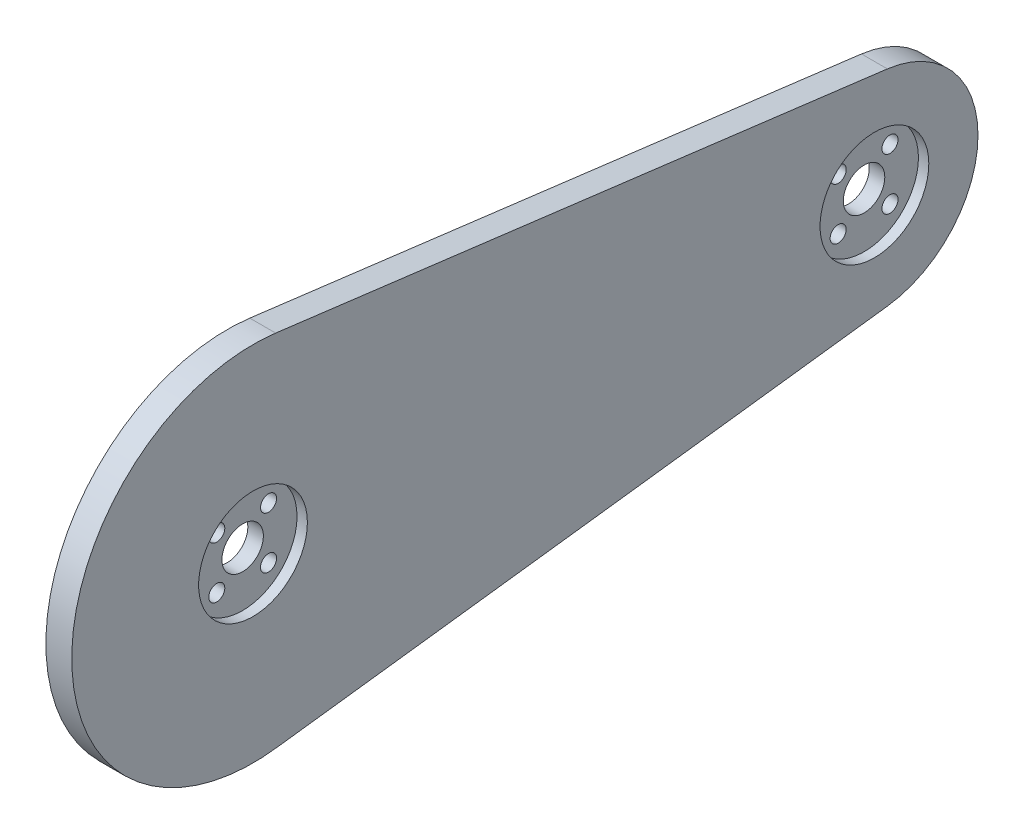
ISO-10303-21;
HEADER;
FILE_DESCRIPTION(('STEP AP214'),'2;1');
FILE_NAME('part.step','',(''),(''),'','','');
FILE_SCHEMA(('AUTOMOTIVE_DESIGN { 1 0 10303 214 1 1 1 1 }'));
ENDSEC;
DATA;
#1=APPLICATION_CONTEXT('core data for automotive mechanical design processes');
#2=APPLICATION_PROTOCOL_DEFINITION('international standard','automotive_design',2000,#1);
#3=PRODUCT_CONTEXT('',#1,'mechanical');
#4=PRODUCT('Part','Part','',(#3));
#5=PRODUCT_RELATED_PRODUCT_CATEGORY('part','',(#4));
#6=PRODUCT_DEFINITION_FORMATION('','',#4);
#7=PRODUCT_DEFINITION_CONTEXT('part definition',#1,'design');
#8=PRODUCT_DEFINITION('design','',#6,#7);
#9=PRODUCT_DEFINITION_SHAPE('','',#8);
#10=(LENGTH_UNIT() NAMED_UNIT(*) SI_UNIT(.MILLI.,.METRE.));
#11=(NAMED_UNIT(*) PLANE_ANGLE_UNIT() SI_UNIT($,.RADIAN.));
#12=(NAMED_UNIT(*) SI_UNIT($,.STERADIAN.) SOLID_ANGLE_UNIT());
#13=UNCERTAINTY_MEASURE_WITH_UNIT(LENGTH_MEASURE(1.E-05),#10,'distance_accuracy_value','');
#14=(GEOMETRIC_REPRESENTATION_CONTEXT(3) GLOBAL_UNCERTAINTY_ASSIGNED_CONTEXT((#13)) GLOBAL_UNIT_ASSIGNED_CONTEXT((#10,
#11,#12)) REPRESENTATION_CONTEXT('',''));
#15=CARTESIAN_POINT('',(0.,0.,0.));
#16=DIRECTION('',(0.,0.,1.));
#17=DIRECTION('',(1.,0.,0.));
#18=AXIS2_PLACEMENT_3D('',#15,#16,#17);
#19=CARTESIAN_POINT('',(5.,-4.99999999999989,-125.));
#20=DIRECTION('',(-1.,0.,0.));
#21=DIRECTION('',(0.,0.,1.));
#22=AXIS2_PLACEMENT_3D('',#19,#20,#21);
#23=CYLINDRICAL_SURFACE('',#22,1.54999999999998);
#24=CARTESIAN_POINT('',(0.,-4.99999999999989,-125.));
#25=DIRECTION('',(1.,0.,0.));
#26=DIRECTION('',(0.,0.,-1.));
#27=AXIS2_PLACEMENT_3D('',#24,#25,#26);
#28=CIRCLE('',#27,1.54999999999998);
#29=CARTESIAN_POINT('',(0.,-4.99999999999989,-126.55));
#30=VERTEX_POINT('',#29);
#31=EDGE_CURVE('E162',#30,#30,#28,.T.);
#32=ORIENTED_EDGE('',*,*,#31,.F.);
#33=EDGE_LOOP('',(#32));
#34=FACE_BOUND('',#33,.T.);
#35=CARTESIAN_POINT('',(3.,-4.99999999999989,-125.));
#36=DIRECTION('',(1.,0.,0.));
#37=DIRECTION('',(0.,0.,-1.));
#38=AXIS2_PLACEMENT_3D('',#35,#36,#37);
#39=CIRCLE('',#38,1.54999999999998);
#40=CARTESIAN_POINT('',(3.,-4.99999999999989,-126.55));
#41=VERTEX_POINT('',#40);
#42=EDGE_CURVE('E209',#41,#41,#39,.T.);
#43=ORIENTED_EDGE('',*,*,#42,.T.);
#44=EDGE_LOOP('',(#43));
#45=FACE_BOUND('',#44,.T.);
#46=ADVANCED_FACE('F47',(#34,#45),#23,.F.);
#47=CARTESIAN_POINT('',(5.,0.,0.));
#48=DIRECTION('',(-1.,0.,0.));
#49=DIRECTION('',(0.,0.,1.));
#50=AXIS2_PLACEMENT_3D('',#47,#48,#49);
#51=CYLINDRICAL_SURFACE('',#50,4.);
#52=CARTESIAN_POINT('',(0.,0.,0.));
#53=DIRECTION('',(1.,0.,0.));
#54=DIRECTION('',(0.,0.,-1.));
#55=AXIS2_PLACEMENT_3D('',#52,#53,#54);
#56=CIRCLE('',#55,4.);
#57=CARTESIAN_POINT('',(0.,0.,-4.));
#58=VERTEX_POINT('',#57);
#59=EDGE_CURVE('E158',#58,#58,#56,.T.);
#60=ORIENTED_EDGE('',*,*,#59,.F.);
#61=EDGE_LOOP('',(#60));
#62=FACE_BOUND('',#61,.T.);
#63=CARTESIAN_POINT('',(3.,0.,0.));
#64=DIRECTION('',(1.,0.,0.));
#65=DIRECTION('',(0.,0.,-1.));
#66=AXIS2_PLACEMENT_3D('',#63,#64,#65);
#67=CIRCLE('',#66,4.);
#68=CARTESIAN_POINT('',(3.,0.,-4.));
#69=VERTEX_POINT('',#68);
#70=EDGE_CURVE('E123',#69,#69,#67,.T.);
#71=ORIENTED_EDGE('',*,*,#70,.T.);
#72=EDGE_LOOP('',(#71));
#73=FACE_BOUND('',#72,.T.);
#74=ADVANCED_FACE('F248',(#62,#73),#51,.F.);
#75=CARTESIAN_POINT('',(5.,-5.00000000000004,-4.99999999999996));
#76=DIRECTION('',(-1.,0.,0.));
#77=DIRECTION('',(0.,0.,1.));
#78=AXIS2_PLACEMENT_3D('',#75,#76,#77);
#79=CYLINDRICAL_SURFACE('',#78,1.55);
#80=CARTESIAN_POINT('',(0.,-5.00000000000004,-4.99999999999996));
#81=DIRECTION('',(1.,0.,0.));
#82=DIRECTION('',(0.,0.,-1.));
#83=AXIS2_PLACEMENT_3D('',#80,#81,#82);
#84=CIRCLE('',#83,1.55);
#85=CARTESIAN_POINT('',(0.,-5.00000000000004,-6.54999999999996));
#86=VERTEX_POINT('',#85);
#87=EDGE_CURVE('E154',#86,#86,#84,.T.);
#88=ORIENTED_EDGE('',*,*,#87,.F.);
#89=EDGE_LOOP('',(#88));
#90=FACE_BOUND('',#89,.T.);
#91=CARTESIAN_POINT('',(3.,-5.00000000000004,-4.99999999999996));
#92=DIRECTION('',(1.,0.,0.));
#93=DIRECTION('',(0.,0.,-1.));
#94=AXIS2_PLACEMENT_3D('',#91,#92,#93);
#95=CIRCLE('',#94,1.55);
#96=CARTESIAN_POINT('',(3.,-5.00000000000004,-6.54999999999996));
#97=VERTEX_POINT('',#96);
#98=EDGE_CURVE('E221',#97,#97,#95,.T.);
#99=ORIENTED_EDGE('',*,*,#98,.T.);
#100=EDGE_LOOP('',(#99));
#101=FACE_BOUND('',#100,.T.);
#102=ADVANCED_FACE('F255',(#90,#101),#79,.F.);
#103=CARTESIAN_POINT('',(5.,-4.99999999999995,5.00000000000005));
#104=DIRECTION('',(-1.,0.,0.));
#105=DIRECTION('',(0.,0.,1.));
#106=AXIS2_PLACEMENT_3D('',#103,#104,#105);
#107=CYLINDRICAL_SURFACE('',#106,1.55);
#108=CARTESIAN_POINT('',(0.,-4.99999999999995,5.00000000000005));
#109=DIRECTION('',(1.,0.,0.));
#110=DIRECTION('',(0.,0.,-1.));
#111=AXIS2_PLACEMENT_3D('',#108,#109,#110);
#112=CIRCLE('',#111,1.55);
#113=CARTESIAN_POINT('',(0.,-4.99999999999995,3.45000000000005));
#114=VERTEX_POINT('',#113);
#115=EDGE_CURVE('E150',#114,#114,#112,.T.);
#116=ORIENTED_EDGE('',*,*,#115,.F.);
#117=EDGE_LOOP('',(#116));
#118=FACE_BOUND('',#117,.T.);
#119=CARTESIAN_POINT('',(3.,-4.99999999999995,5.00000000000005));
#120=DIRECTION('',(1.,0.,0.));
#121=DIRECTION('',(0.,0.,-1.));
#122=AXIS2_PLACEMENT_3D('',#119,#120,#121);
#123=CIRCLE('',#122,1.55);
#124=CARTESIAN_POINT('',(3.,-4.99999999999995,3.45000000000005));
#125=VERTEX_POINT('',#124);
#126=EDGE_CURVE('E217',#125,#125,#123,.T.);
#127=ORIENTED_EDGE('',*,*,#126,.T.);
#128=EDGE_LOOP('',(#127));
#129=FACE_BOUND('',#128,.T.);
#130=ADVANCED_FACE('F266',(#118,#129),#107,.F.);
#131=CARTESIAN_POINT('',(5.,4.99999999999998,-5.00000000000002));
#132=DIRECTION('',(-1.,0.,0.));
#133=DIRECTION('',(0.,0.,1.));
#134=AXIS2_PLACEMENT_3D('',#131,#132,#133);
#135=CYLINDRICAL_SURFACE('',#134,1.55);
#136=CARTESIAN_POINT('',(0.,4.99999999999998,-5.00000000000002));
#137=DIRECTION('',(1.,0.,0.));
#138=DIRECTION('',(0.,0.,-1.));
#139=AXIS2_PLACEMENT_3D('',#136,#137,#138);
#140=CIRCLE('',#139,1.55);
#141=CARTESIAN_POINT('',(0.,4.99999999999998,-6.55000000000002));
#142=VERTEX_POINT('',#141);
#143=EDGE_CURVE('E146',#142,#142,#140,.T.);
#144=ORIENTED_EDGE('',*,*,#143,.F.);
#145=EDGE_LOOP('',(#144));
#146=FACE_BOUND('',#145,.T.);
#147=CARTESIAN_POINT('',(3.,4.99999999999998,-5.00000000000002));
#148=DIRECTION('',(1.,0.,0.));
#149=DIRECTION('',(0.,0.,-1.));
#150=AXIS2_PLACEMENT_3D('',#147,#148,#149);
#151=CIRCLE('',#150,1.55);
#152=CARTESIAN_POINT('',(3.,4.99999999999998,-6.55000000000002));
#153=VERTEX_POINT('',#152);
#154=EDGE_CURVE('E213',#153,#153,#151,.T.);
#155=ORIENTED_EDGE('',*,*,#154,.T.);
#156=EDGE_LOOP('',(#155));
#157=FACE_BOUND('',#156,.T.);
#158=ADVANCED_FACE('F270',(#146,#157),#135,.F.);
#159=CARTESIAN_POINT('',(5.,5.,5.));
#160=DIRECTION('',(-1.,0.,0.));
#161=DIRECTION('',(0.,0.,1.));
#162=AXIS2_PLACEMENT_3D('',#159,#160,#161);
#163=CYLINDRICAL_SURFACE('',#162,1.55);
#164=CARTESIAN_POINT('',(0.,5.,5.));
#165=DIRECTION('',(1.,0.,0.));
#166=DIRECTION('',(0.,0.,-1.));
#167=AXIS2_PLACEMENT_3D('',#164,#165,#166);
#168=CIRCLE('',#167,1.55);
#169=CARTESIAN_POINT('',(0.,5.,3.45));
#170=VERTEX_POINT('',#169);
#171=EDGE_CURVE('E142',#170,#170,#168,.T.);
#172=ORIENTED_EDGE('',*,*,#171,.F.);
#173=EDGE_LOOP('',(#172));
#174=FACE_BOUND('',#173,.T.);
#175=CARTESIAN_POINT('',(3.,5.,5.));
#176=DIRECTION('',(1.,0.,0.));
#177=DIRECTION('',(0.,0.,-1.));
#178=AXIS2_PLACEMENT_3D('',#175,#176,#177);
#179=CIRCLE('',#178,1.55);
#180=CARTESIAN_POINT('',(3.,5.,3.45));
#181=VERTEX_POINT('',#180);
#182=EDGE_CURVE('E51',#181,#181,#179,.T.);
#183=ORIENTED_EDGE('',*,*,#182,.T.);
#184=EDGE_LOOP('',(#183));
#185=FACE_BOUND('',#184,.T.);
#186=ADVANCED_FACE('F232',(#174,#185),#163,.F.);
#187=CARTESIAN_POINT('',(5.,-4.99999999999995,-115.));
#188=DIRECTION('',(-1.,0.,0.));
#189=DIRECTION('',(0.,0.,1.));
#190=AXIS2_PLACEMENT_3D('',#187,#188,#189);
#191=CYLINDRICAL_SURFACE('',#190,1.54999999999999);
#192=CARTESIAN_POINT('',(0.,-4.99999999999995,-115.));
#193=DIRECTION('',(1.,0.,0.));
#194=DIRECTION('',(0.,0.,-1.));
#195=AXIS2_PLACEMENT_3D('',#192,#193,#194);
#196=CIRCLE('',#195,1.54999999999999);
#197=CARTESIAN_POINT('',(0.,-4.99999999999995,-116.55));
#198=VERTEX_POINT('',#197);
#199=EDGE_CURVE('E127',#198,#198,#196,.T.);
#200=ORIENTED_EDGE('',*,*,#199,.F.);
#201=EDGE_LOOP('',(#200));
#202=FACE_BOUND('',#201,.T.);
#203=CARTESIAN_POINT('',(3.,-4.99999999999995,-115.));
#204=DIRECTION('',(1.,0.,0.));
#205=DIRECTION('',(0.,0.,-1.));
#206=AXIS2_PLACEMENT_3D('',#203,#204,#205);
#207=CIRCLE('',#206,1.54999999999999);
#208=CARTESIAN_POINT('',(3.,-4.99999999999995,-116.55));
#209=VERTEX_POINT('',#208);
#210=EDGE_CURVE('E205',#209,#209,#207,.T.);
#211=ORIENTED_EDGE('',*,*,#210,.T.);
#212=EDGE_LOOP('',(#211));
#213=FACE_BOUND('',#212,.T.);
#214=ADVANCED_FACE('F277',(#202,#213),#191,.F.);
#215=CARTESIAN_POINT('',(5.,5.00000000000016,-125.));
#216=DIRECTION('',(-1.,0.,0.));
#217=DIRECTION('',(0.,0.,1.));
#218=AXIS2_PLACEMENT_3D('',#215,#216,#217);
#219=CYLINDRICAL_SURFACE('',#218,1.54999999999999);
#220=CARTESIAN_POINT('',(0.,5.00000000000016,-125.));
#221=DIRECTION('',(1.,0.,0.));
#222=DIRECTION('',(0.,0.,-1.));
#223=AXIS2_PLACEMENT_3D('',#220,#221,#222);
#224=CIRCLE('',#223,1.54999999999999);
#225=CARTESIAN_POINT('',(0.,5.00000000000016,-126.55));
#226=VERTEX_POINT('',#225);
#227=EDGE_CURVE('E122',#226,#226,#224,.T.);
#228=ORIENTED_EDGE('',*,*,#227,.F.);
#229=EDGE_LOOP('',(#228));
#230=FACE_BOUND('',#229,.T.);
#231=CARTESIAN_POINT('',(3.,5.00000000000016,-125.));
#232=DIRECTION('',(1.,0.,0.));
#233=DIRECTION('',(0.,0.,-1.));
#234=AXIS2_PLACEMENT_3D('',#231,#232,#233);
#235=CIRCLE('',#234,1.54999999999999);
#236=CARTESIAN_POINT('',(3.,5.00000000000016,-126.55));
#237=VERTEX_POINT('',#236);
#238=EDGE_CURVE('E183',#237,#237,#235,.T.);
#239=ORIENTED_EDGE('',*,*,#238,.T.);
#240=EDGE_LOOP('',(#239));
#241=FACE_BOUND('',#240,.T.);
#242=ADVANCED_FACE('F291',(#230,#241),#219,.F.);
#243=CARTESIAN_POINT('',(5.,5.,-115.));
#244=DIRECTION('',(-1.,0.,0.));
#245=DIRECTION('',(0.,0.,1.));
#246=AXIS2_PLACEMENT_3D('',#243,#244,#245);
#247=CYLINDRICAL_SURFACE('',#246,1.54999999999999);
#248=CARTESIAN_POINT('',(0.,5.,-115.));
#249=DIRECTION('',(1.,0.,0.));
#250=DIRECTION('',(0.,0.,-1.));
#251=AXIS2_PLACEMENT_3D('',#248,#249,#250);
#252=CIRCLE('',#251,1.54999999999999);
#253=CARTESIAN_POINT('',(0.,5.,-116.55));
#254=VERTEX_POINT('',#253);
#255=EDGE_CURVE('E118',#254,#254,#252,.T.);
#256=ORIENTED_EDGE('',*,*,#255,.F.);
#257=EDGE_LOOP('',(#256));
#258=FACE_BOUND('',#257,.T.);
#259=CARTESIAN_POINT('',(3.,5.,-115.));
#260=DIRECTION('',(1.,0.,0.));
#261=DIRECTION('',(0.,0.,-1.));
#262=AXIS2_PLACEMENT_3D('',#259,#260,#261);
#263=CIRCLE('',#262,1.54999999999999);
#264=CARTESIAN_POINT('',(3.,5.,-116.55));
#265=VERTEX_POINT('',#264);
#266=EDGE_CURVE('E176',#265,#265,#263,.T.);
#267=ORIENTED_EDGE('',*,*,#266,.T.);
#268=EDGE_LOOP('',(#267));
#269=FACE_BOUND('',#268,.T.);
#270=ADVANCED_FACE('F49',(#258,#269),#247,.F.);
#271=CARTESIAN_POINT('',(5.,0.,-120.));
#272=DIRECTION('',(-1.,0.,0.));
#273=DIRECTION('',(0.,0.,1.));
#274=AXIS2_PLACEMENT_3D('',#271,#272,#273);
#275=CYLINDRICAL_SURFACE('',#274,4.00000000000001);
#276=CARTESIAN_POINT('',(0.,0.,-120.));
#277=DIRECTION('',(1.,0.,0.));
#278=DIRECTION('',(0.,0.,-1.));
#279=AXIS2_PLACEMENT_3D('',#276,#277,#278);
#280=CIRCLE('',#279,4.00000000000001);
#281=CARTESIAN_POINT('',(0.,0.,-124.));
#282=VERTEX_POINT('',#281);
#283=EDGE_CURVE('E166',#282,#282,#280,.T.);
#284=ORIENTED_EDGE('',*,*,#283,.F.);
#285=EDGE_LOOP('',(#284));
#286=FACE_BOUND('',#285,.T.);
#287=CARTESIAN_POINT('',(3.,0.,-120.));
#288=DIRECTION('',(1.,0.,0.));
#289=DIRECTION('',(0.,0.,-1.));
#290=AXIS2_PLACEMENT_3D('',#287,#288,#289);
#291=CIRCLE('',#290,4.00000000000001);
#292=CARTESIAN_POINT('',(3.,0.,-124.));
#293=VERTEX_POINT('',#292);
#294=EDGE_CURVE('E173',#293,#293,#291,.T.);
#295=ORIENTED_EDGE('',*,*,#294,.T.);
#296=EDGE_LOOP('',(#295));
#297=FACE_BOUND('',#296,.T.);
#298=ADVANCED_FACE('F261',(#286,#297),#275,.F.);
#299=CARTESIAN_POINT('',(5.,-34.7200280183255,-4.37262002707089));
#300=DIRECTION('',(0.,0.992162738142365,0.124952395102475));
#301=DIRECTION('',(0.,-0.124952395102475,0.992162738142365));
#302=AXIS2_PLACEMENT_3D('',#299,#300,#301);
#303=PLANE('',#302);
#304=DIRECTION('',(0.,0.124952395102475,-0.992162738142365));
#305=VECTOR('',#304,1.);
#306=CARTESIAN_POINT('',(0.,-34.7200280183255,-4.37262002707089));
#307=LINE('',#306,#305);
#308=CARTESIAN_POINT('',(0.,-34.6410161513773,-5.0000000000019));
#309=VERTEX_POINT('',#308);
#310=CARTESIAN_POINT('',(0.,-19.8432547628473,-122.499047902049));
#311=VERTEX_POINT('',#310);
#312=EDGE_CURVE('E131',#309,#311,#307,.T.);
#313=ORIENTED_EDGE('',*,*,#312,.T.);
#314=DIRECTION('',(-1.,0.,0.));
#315=VECTOR('',#314,1.);
#316=CARTESIAN_POINT('',(5.,-19.8432547628473,-122.499047902049));
#317=LINE('',#316,#315);
#318=CARTESIAN_POINT('',(5.,-19.8432547628473,-122.499047902049));
#319=VERTEX_POINT('',#318);
#320=EDGE_CURVE('E11',#319,#311,#317,.T.);
#321=ORIENTED_EDGE('',*,*,#320,.F.);
#322=DIRECTION('',(0.,0.124952395102475,-0.992162738142365));
#323=VECTOR('',#322,1.);
#324=CARTESIAN_POINT('',(5.,-34.7200280183255,-4.37262002707089));
#325=LINE('',#324,#323);
#326=CARTESIAN_POINT('',(5.,-34.6410161513773,-5.0000000000019));
#327=VERTEX_POINT('',#326);
#328=EDGE_CURVE('E98',#327,#319,#325,.T.);
#329=ORIENTED_EDGE('',*,*,#328,.F.);
#330=DIRECTION('',(-1.,0.,0.));
#331=VECTOR('',#330,1.);
#332=CARTESIAN_POINT('',(5.,-34.6410161513773,-5.0000000000019));
#333=LINE('',#332,#331);
#334=EDGE_CURVE('E114',#327,#309,#333,.T.);
#335=ORIENTED_EDGE('',*,*,#334,.T.);
#336=EDGE_LOOP('',(#313,#321,#329,#335));
#337=FACE_BOUND('',#336,.T.);
#338=ADVANCED_FACE('F286',(#337),#303,.F.);
#339=CARTESIAN_POINT('',(5.,0.,-120.));
#340=DIRECTION('',(-1.,0.,0.));
#341=DIRECTION('',(0.,0.,1.));
#342=AXIS2_PLACEMENT_3D('',#339,#340,#341);
#343=CYLINDRICAL_SURFACE('',#342,20.);
#344=CARTESIAN_POINT('',(0.,0.,-120.));
#345=DIRECTION('',(1.,0.,0.));
#346=DIRECTION('',(0.,0.,-1.));
#347=AXIS2_PLACEMENT_3D('',#344,#345,#346);
#348=CIRCLE('',#347,20.);
#349=CARTESIAN_POINT('',(0.,19.8431348329844,-122.5));
#350=VERTEX_POINT('',#349);
#351=EDGE_CURVE('E104',#311,#350,#348,.T.);
#352=ORIENTED_EDGE('',*,*,#351,.T.);
#353=DIRECTION('',(-1.,0.,0.));
#354=VECTOR('',#353,1.);
#355=CARTESIAN_POINT('',(5.,19.8431348329844,-122.5));
#356=LINE('',#355,#354);
#357=CARTESIAN_POINT('',(5.,19.8431348329844,-122.5));
#358=VERTEX_POINT('',#357);
#359=EDGE_CURVE('E58',#358,#350,#356,.T.);
#360=ORIENTED_EDGE('',*,*,#359,.F.);
#361=CARTESIAN_POINT('',(5.,0.,-120.));
#362=DIRECTION('',(1.,0.,0.));
#363=DIRECTION('',(0.,0.,-1.));
#364=AXIS2_PLACEMENT_3D('',#361,#362,#363);
#365=CIRCLE('',#364,20.);
#366=EDGE_CURVE('E93',#319,#358,#365,.T.);
#367=ORIENTED_EDGE('',*,*,#366,.F.);
#368=ORIENTED_EDGE('',*,*,#320,.T.);
#369=EDGE_LOOP('',(#352,#360,#367,#368));
#370=FACE_BOUND('',#369,.T.);
#371=ADVANCED_FACE('F103',(#370),#343,.T.);
#372=CARTESIAN_POINT('',(5.,34.7254859577227,-4.375));
#373=DIRECTION('',(0.,0.992156741649222,-0.125));
#374=DIRECTION('',(0.,0.125,0.992156741649222));
#375=AXIS2_PLACEMENT_3D('',#372,#373,#374);
#376=PLANE('',#375);
#377=DIRECTION('',(0.,-0.125,-0.992156741649222));
#378=VECTOR('',#377,1.);
#379=CARTESIAN_POINT('',(0.,34.7254859577227,-4.375));
#380=LINE('',#379,#378);
#381=CARTESIAN_POINT('',(0.,34.7254859577228,-4.375));
#382=VERTEX_POINT('',#381);
#383=EDGE_CURVE('E137',#382,#350,#380,.T.);
#384=ORIENTED_EDGE('',*,*,#383,.F.);
#385=DIRECTION('',(-1.,0.,0.));
#386=VECTOR('',#385,1.);
#387=CARTESIAN_POINT('',(5.,34.7254859577228,-4.375));
#388=LINE('',#387,#386);
#389=CARTESIAN_POINT('',(5.,34.7254859577228,-4.375));
#390=VERTEX_POINT('',#389);
#391=EDGE_CURVE('E83',#390,#382,#388,.T.);
#392=ORIENTED_EDGE('',*,*,#391,.F.);
#393=DIRECTION('',(0.,-0.125,-0.992156741649222));
#394=VECTOR('',#393,1.);
#395=CARTESIAN_POINT('',(5.,34.7254859577227,-4.375));
#396=LINE('',#395,#394);
#397=EDGE_CURVE('E96',#390,#358,#396,.T.);
#398=ORIENTED_EDGE('',*,*,#397,.T.);
#399=ORIENTED_EDGE('',*,*,#359,.T.);
#400=EDGE_LOOP('',(#384,#392,#398,#399));
#401=FACE_BOUND('',#400,.T.);
#402=ADVANCED_FACE('F110',(#401),#376,.T.);
#403=CARTESIAN_POINT('',(5.,0.,0.));
#404=DIRECTION('',(-1.,0.,0.));
#405=DIRECTION('',(0.,0.,1.));
#406=AXIS2_PLACEMENT_3D('',#403,#404,#405);
#407=CYLINDRICAL_SURFACE('',#406,35.);
#408=CARTESIAN_POINT('',(0.,0.,0.));
#409=DIRECTION('',(1.,0.,0.));
#410=DIRECTION('',(0.,0.,-1.));
#411=AXIS2_PLACEMENT_3D('',#408,#409,#410);
#412=CIRCLE('',#411,35.);
#413=EDGE_CURVE('E86',#382,#309,#412,.T.);
#414=ORIENTED_EDGE('',*,*,#413,.T.);
#415=ORIENTED_EDGE('',*,*,#334,.F.);
#416=CARTESIAN_POINT('',(5.,0.,0.));
#417=DIRECTION('',(1.,0.,0.));
#418=DIRECTION('',(0.,0.,-1.));
#419=AXIS2_PLACEMENT_3D('',#416,#417,#418);
#420=CIRCLE('',#419,35.);
#421=EDGE_CURVE('E67',#390,#327,#420,.T.);
#422=ORIENTED_EDGE('',*,*,#421,.F.);
#423=ORIENTED_EDGE('',*,*,#391,.T.);
#424=EDGE_LOOP('',(#414,#415,#422,#423));
#425=FACE_BOUND('',#424,.T.);
#426=ADVANCED_FACE('F279',(#425),#407,.T.);
#427=CARTESIAN_POINT('',(5.,0.,0.));
#428=DIRECTION('',(1.,0.,0.));
#429=DIRECTION('',(0.,0.,-1.));
#430=AXIS2_PLACEMENT_3D('',#427,#428,#429);
#431=PLANE('',#430);
#432=CARTESIAN_POINT('',(5.,0.,0.));
#433=DIRECTION('',(1.,0.,0.));
#434=DIRECTION('',(0.,0.,-1.));
#435=AXIS2_PLACEMENT_3D('',#432,#433,#434);
#436=CIRCLE('',#435,10.5);
#437=CARTESIAN_POINT('',(5.,0.,-10.5));
#438=VERTEX_POINT('',#437);
#439=EDGE_CURVE('E186',#438,#438,#436,.T.);
#440=ORIENTED_EDGE('',*,*,#439,.F.);
#441=EDGE_LOOP('',(#440));
#442=FACE_BOUND('',#441,.T.);
#443=CARTESIAN_POINT('',(5.,0.,-120.));
#444=DIRECTION('',(1.,0.,0.));
#445=DIRECTION('',(0.,0.,-1.));
#446=AXIS2_PLACEMENT_3D('',#443,#444,#445);
#447=CIRCLE('',#446,10.5);
#448=CARTESIAN_POINT('',(5.,0.,-130.5));
#449=VERTEX_POINT('',#448);
#450=EDGE_CURVE('E192',#449,#449,#447,.T.);
#451=ORIENTED_EDGE('',*,*,#450,.F.);
#452=EDGE_LOOP('',(#451));
#453=FACE_BOUND('',#452,.T.);
#454=ORIENTED_EDGE('',*,*,#328,.T.);
#455=ORIENTED_EDGE('',*,*,#366,.T.);
#456=ORIENTED_EDGE('',*,*,#397,.F.);
#457=ORIENTED_EDGE('',*,*,#421,.T.);
#458=EDGE_LOOP('',(#454,#455,#456,#457));
#459=FACE_BOUND('',#458,.T.);
#460=ADVANCED_FACE('F94',(#442,#453,#459),#431,.T.);
#461=CARTESIAN_POINT('',(0.,0.,0.));
#462=DIRECTION('',(1.,0.,0.));
#463=DIRECTION('',(0.,0.,-1.));
#464=AXIS2_PLACEMENT_3D('',#461,#462,#463);
#465=PLANE('',#464);
#466=ORIENTED_EDGE('',*,*,#255,.T.);
#467=EDGE_LOOP('',(#466));
#468=FACE_BOUND('',#467,.T.);
#469=ORIENTED_EDGE('',*,*,#227,.T.);
#470=EDGE_LOOP('',(#469));
#471=FACE_BOUND('',#470,.T.);
#472=ORIENTED_EDGE('',*,*,#199,.T.);
#473=EDGE_LOOP('',(#472));
#474=FACE_BOUND('',#473,.T.);
#475=ORIENTED_EDGE('',*,*,#312,.F.);
#476=ORIENTED_EDGE('',*,*,#413,.F.);
#477=ORIENTED_EDGE('',*,*,#383,.T.);
#478=ORIENTED_EDGE('',*,*,#351,.F.);
#479=EDGE_LOOP('',(#475,#476,#477,#478));
#480=FACE_BOUND('',#479,.T.);
#481=ORIENTED_EDGE('',*,*,#171,.T.);
#482=EDGE_LOOP('',(#481));
#483=FACE_BOUND('',#482,.T.);
#484=ORIENTED_EDGE('',*,*,#143,.T.);
#485=EDGE_LOOP('',(#484));
#486=FACE_BOUND('',#485,.T.);
#487=ORIENTED_EDGE('',*,*,#115,.T.);
#488=EDGE_LOOP('',(#487));
#489=FACE_BOUND('',#488,.T.);
#490=ORIENTED_EDGE('',*,*,#87,.T.);
#491=EDGE_LOOP('',(#490));
#492=FACE_BOUND('',#491,.T.);
#493=ORIENTED_EDGE('',*,*,#59,.T.);
#494=EDGE_LOOP('',(#493));
#495=FACE_BOUND('',#494,.T.);
#496=ORIENTED_EDGE('',*,*,#31,.T.);
#497=EDGE_LOOP('',(#496));
#498=FACE_BOUND('',#497,.T.);
#499=ORIENTED_EDGE('',*,*,#283,.T.);
#500=EDGE_LOOP('',(#499));
#501=FACE_BOUND('',#500,.T.);
#502=ADVANCED_FACE('F315',(#468,#471,#474,#480,#483,#486,#489,#492,#495,#498,#501),#465,.F.);
#503=CARTESIAN_POINT('',(3.,0.,-120.));
#504=DIRECTION('',(1.,0.,0.));
#505=DIRECTION('',(0.,0.,-1.));
#506=AXIS2_PLACEMENT_3D('',#503,#504,#505);
#507=CYLINDRICAL_SURFACE('',#506,10.5);
#508=CARTESIAN_POINT('',(3.,0.,-120.));
#509=DIRECTION('',(1.,0.,0.));
#510=DIRECTION('',(0.,0.,-1.));
#511=AXIS2_PLACEMENT_3D('',#508,#509,#510);
#512=CIRCLE('',#511,10.5);
#513=CARTESIAN_POINT('',(3.,0.,-130.5));
#514=VERTEX_POINT('',#513);
#515=EDGE_CURVE('E198',#514,#514,#512,.T.);
#516=ORIENTED_EDGE('',*,*,#515,.F.);
#517=EDGE_LOOP('',(#516));
#518=FACE_BOUND('',#517,.T.);
#519=ORIENTED_EDGE('',*,*,#450,.T.);
#520=EDGE_LOOP('',(#519));
#521=FACE_BOUND('',#520,.T.);
#522=ADVANCED_FACE('F305',(#518,#521),#507,.F.);
#523=CARTESIAN_POINT('',(3.,0.,-120.));
#524=DIRECTION('',(1.,0.,0.));
#525=DIRECTION('',(0.,0.,-1.));
#526=AXIS2_PLACEMENT_3D('',#523,#524,#525);
#527=PLANE('',#526);
#528=ORIENTED_EDGE('',*,*,#42,.F.);
#529=EDGE_LOOP('',(#528));
#530=FACE_BOUND('',#529,.T.);
#531=ORIENTED_EDGE('',*,*,#210,.F.);
#532=EDGE_LOOP('',(#531));
#533=FACE_BOUND('',#532,.T.);
#534=ORIENTED_EDGE('',*,*,#238,.F.);
#535=EDGE_LOOP('',(#534));
#536=FACE_BOUND('',#535,.T.);
#537=ORIENTED_EDGE('',*,*,#266,.F.);
#538=EDGE_LOOP('',(#537));
#539=FACE_BOUND('',#538,.T.);
#540=ORIENTED_EDGE('',*,*,#294,.F.);
#541=EDGE_LOOP('',(#540));
#542=FACE_BOUND('',#541,.T.);
#543=ORIENTED_EDGE('',*,*,#515,.T.);
#544=EDGE_LOOP('',(#543));
#545=FACE_BOUND('',#544,.T.);
#546=ADVANCED_FACE('F242',(#530,#533,#536,#539,#542,#545),#527,.T.);
#547=CARTESIAN_POINT('',(3.,0.,0.));
#548=DIRECTION('',(1.,0.,0.));
#549=DIRECTION('',(0.,0.,-1.));
#550=AXIS2_PLACEMENT_3D('',#547,#548,#549);
#551=CYLINDRICAL_SURFACE('',#550,10.5);
#552=CARTESIAN_POINT('',(3.,0.,0.));
#553=DIRECTION('',(1.,0.,0.));
#554=DIRECTION('',(0.,0.,-1.));
#555=AXIS2_PLACEMENT_3D('',#552,#553,#554);
#556=CIRCLE('',#555,10.5);
#557=CARTESIAN_POINT('',(3.,0.,-10.5));
#558=VERTEX_POINT('',#557);
#559=EDGE_CURVE('E177',#558,#558,#556,.T.);
#560=ORIENTED_EDGE('',*,*,#559,.F.);
#561=EDGE_LOOP('',(#560));
#562=FACE_BOUND('',#561,.T.);
#563=ORIENTED_EDGE('',*,*,#439,.T.);
#564=EDGE_LOOP('',(#563));
#565=FACE_BOUND('',#564,.T.);
#566=ADVANCED_FACE('F236',(#562,#565),#551,.F.);
#567=CARTESIAN_POINT('',(3.,0.,0.));
#568=DIRECTION('',(1.,0.,0.));
#569=DIRECTION('',(0.,0.,-1.));
#570=AXIS2_PLACEMENT_3D('',#567,#568,#569);
#571=PLANE('',#570);
#572=ORIENTED_EDGE('',*,*,#70,.F.);
#573=EDGE_LOOP('',(#572));
#574=FACE_BOUND('',#573,.T.);
#575=ORIENTED_EDGE('',*,*,#98,.F.);
#576=EDGE_LOOP('',(#575));
#577=FACE_BOUND('',#576,.T.);
#578=ORIENTED_EDGE('',*,*,#126,.F.);
#579=EDGE_LOOP('',(#578));
#580=FACE_BOUND('',#579,.T.);
#581=ORIENTED_EDGE('',*,*,#154,.F.);
#582=EDGE_LOOP('',(#581));
#583=FACE_BOUND('',#582,.T.);
#584=ORIENTED_EDGE('',*,*,#182,.F.);
#585=EDGE_LOOP('',(#584));
#586=FACE_BOUND('',#585,.T.);
#587=ORIENTED_EDGE('',*,*,#559,.T.);
#588=EDGE_LOOP('',(#587));
#589=FACE_BOUND('',#588,.T.);
#590=ADVANCED_FACE('F234',(#574,#577,#580,#583,#586,#589),#571,.T.);
#591=CLOSED_SHELL('',(#46,#74,#102,#130,#158,#186,#214,#242,#270,#298,#338,#371,#402,#426,#460,
#502,#522,#546,#566,#590));
#592=MANIFOLD_SOLID_BREP('B2',#591);
#593=ADVANCED_BREP_SHAPE_REPRESENTATION('',(#18,#592),#14);
#594=SHAPE_DEFINITION_REPRESENTATION(#9,#593);
ENDSEC;
END-ISO-10303-21;
